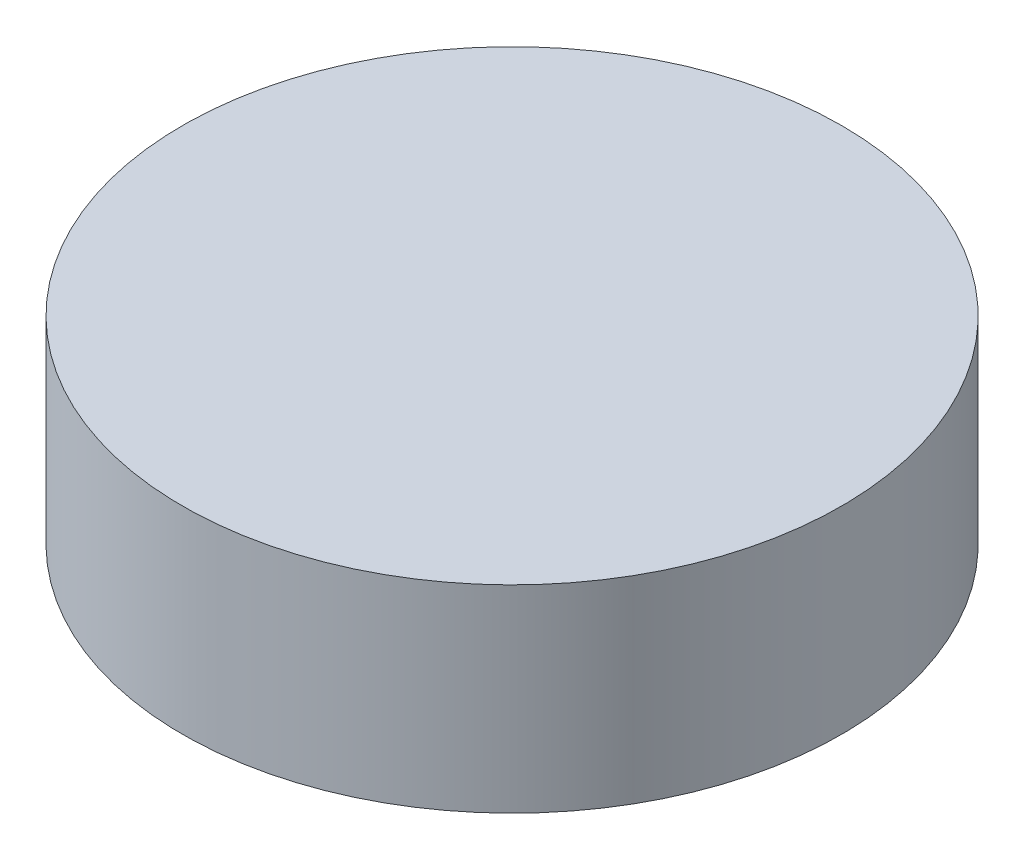
ISO-10303-21;
HEADER;
FILE_DESCRIPTION(('STEP AP214'),'2;1');
FILE_NAME('part.step','',(''),(''),'','','');
FILE_SCHEMA(('AUTOMOTIVE_DESIGN { 1 0 10303 214 1 1 1 1 }'));
ENDSEC;
DATA;
#1=APPLICATION_CONTEXT('core data for automotive mechanical design processes');
#2=APPLICATION_PROTOCOL_DEFINITION('international standard','automotive_design',2000,#1);
#3=PRODUCT_CONTEXT('',#1,'mechanical');
#4=PRODUCT('Part','Part','',(#3));
#5=PRODUCT_RELATED_PRODUCT_CATEGORY('part','',(#4));
#6=PRODUCT_DEFINITION_FORMATION('','',#4);
#7=PRODUCT_DEFINITION_CONTEXT('part definition',#1,'design');
#8=PRODUCT_DEFINITION('design','',#6,#7);
#9=PRODUCT_DEFINITION_SHAPE('','',#8);
#10=(LENGTH_UNIT() NAMED_UNIT(*) SI_UNIT(.MILLI.,.METRE.));
#11=(NAMED_UNIT(*) PLANE_ANGLE_UNIT() SI_UNIT($,.RADIAN.));
#12=(NAMED_UNIT(*) SI_UNIT($,.STERADIAN.) SOLID_ANGLE_UNIT());
#13=UNCERTAINTY_MEASURE_WITH_UNIT(LENGTH_MEASURE(1.E-05),#10,'distance_accuracy_value','');
#14=(GEOMETRIC_REPRESENTATION_CONTEXT(3) GLOBAL_UNCERTAINTY_ASSIGNED_CONTEXT((#13)) GLOBAL_UNIT_ASSIGNED_CONTEXT((#10,
#11,#12)) REPRESENTATION_CONTEXT('',''));
#15=CARTESIAN_POINT('',(0.,0.,0.));
#16=DIRECTION('',(0.,0.,1.));
#17=DIRECTION('',(1.,0.,0.));
#18=AXIS2_PLACEMENT_3D('',#15,#16,#17);
#19=CARTESIAN_POINT('',(0.,76.2,0.));
#20=DIRECTION('',(0.,-1.,0.));
#21=DIRECTION('',(0.,0.,-1.));
#22=AXIS2_PLACEMENT_3D('',#19,#20,#21);
#23=CYLINDRICAL_SURFACE('',#22,127.);
#24=CARTESIAN_POINT('',(0.,76.2,0.));
#25=DIRECTION('',(0.,1.,0.));
#26=DIRECTION('',(0.,0.,1.));
#27=AXIS2_PLACEMENT_3D('',#24,#25,#26);
#28=CIRCLE('',#27,127.);
#29=CARTESIAN_POINT('',(0.,76.2,-127.));
#30=VERTEX_POINT('',#29);
#31=EDGE_CURVE('E10',#30,#30,#28,.T.);
#32=CARTESIAN_POINT('',(0.,0.,0.));
#33=DIRECTION('',(0.,1.,0.));
#34=DIRECTION('',(0.,0.,1.));
#35=AXIS2_PLACEMENT_3D('',#32,#33,#34);
#36=CIRCLE('',#35,127.);
#37=CARTESIAN_POINT('',(0.,0.,-127.));
#38=VERTEX_POINT('',#37);
#39=EDGE_CURVE('E36',#38,#38,#36,.T.);
#40=CARTESIAN_POINT('',(0.,76.2,-127.));
#41=CARTESIAN_POINT('',(0.,75.40625,-127.));
#42=CARTESIAN_POINT('',(0.,74.6125,-127.));
#43=CARTESIAN_POINT('',(0.,73.025,-127.));
#44=CARTESIAN_POINT('',(0.,72.23125,-127.));
#45=CARTESIAN_POINT('',(0.,70.64375,-127.));
#46=CARTESIAN_POINT('',(0.,69.85,-127.));
#47=CARTESIAN_POINT('',(0.,68.2625,-127.));
#48=CARTESIAN_POINT('',(0.,67.46875,-127.));
#49=CARTESIAN_POINT('',(0.,65.88125,-127.));
#50=CARTESIAN_POINT('',(0.,65.0875,-127.));
#51=CARTESIAN_POINT('',(0.,63.5,-127.));
#52=CARTESIAN_POINT('',(0.,62.70625,-127.));
#53=CARTESIAN_POINT('',(0.,61.11875,-127.));
#54=CARTESIAN_POINT('',(0.,60.325,-127.));
#55=CARTESIAN_POINT('',(0.,58.7375,-127.));
#56=CARTESIAN_POINT('',(0.,57.94375,-127.));
#57=CARTESIAN_POINT('',(0.,56.35625,-127.));
#58=CARTESIAN_POINT('',(0.,55.5625,-127.));
#59=CARTESIAN_POINT('',(0.,53.975,-127.));
#60=CARTESIAN_POINT('',(0.,53.18125,-127.));
#61=CARTESIAN_POINT('',(0.,51.59375,-127.));
#62=CARTESIAN_POINT('',(0.,50.8,-127.));
#63=CARTESIAN_POINT('',(0.,49.2125,-127.));
#64=CARTESIAN_POINT('',(0.,48.41875,-127.));
#65=CARTESIAN_POINT('',(0.,46.83125,-127.));
#66=CARTESIAN_POINT('',(0.,46.0375,-127.));
#67=CARTESIAN_POINT('',(0.,44.45,-127.));
#68=CARTESIAN_POINT('',(0.,43.65625,-127.));
#69=CARTESIAN_POINT('',(0.,42.06875,-127.));
#70=CARTESIAN_POINT('',(0.,41.275,-127.));
#71=CARTESIAN_POINT('',(0.,39.6875,-127.));
#72=CARTESIAN_POINT('',(0.,38.89375,-127.));
#73=CARTESIAN_POINT('',(0.,37.30625,-127.));
#74=CARTESIAN_POINT('',(0.,36.5125,-127.));
#75=CARTESIAN_POINT('',(0.,34.925,-127.));
#76=CARTESIAN_POINT('',(0.,34.13125,-127.));
#77=CARTESIAN_POINT('',(0.,32.54375,-127.));
#78=CARTESIAN_POINT('',(0.,31.75,-127.));
#79=CARTESIAN_POINT('',(0.,30.1625,-127.));
#80=CARTESIAN_POINT('',(0.,29.36875,-127.));
#81=CARTESIAN_POINT('',(0.,27.78125,-127.));
#82=CARTESIAN_POINT('',(0.,26.9875,-127.));
#83=CARTESIAN_POINT('',(0.,25.4,-127.));
#84=CARTESIAN_POINT('',(0.,24.60625,-127.));
#85=CARTESIAN_POINT('',(0.,23.01875,-127.));
#86=CARTESIAN_POINT('',(0.,22.225,-127.));
#87=CARTESIAN_POINT('',(0.,20.6375,-127.));
#88=CARTESIAN_POINT('',(0.,19.84375,-127.));
#89=CARTESIAN_POINT('',(0.,18.25625,-127.));
#90=CARTESIAN_POINT('',(0.,17.4625,-127.));
#91=CARTESIAN_POINT('',(0.,15.875,-127.));
#92=CARTESIAN_POINT('',(0.,15.08125,-127.));
#93=CARTESIAN_POINT('',(0.,13.49375,-127.));
#94=CARTESIAN_POINT('',(0.,12.7,-127.));
#95=CARTESIAN_POINT('',(0.,11.1125,-127.));
#96=CARTESIAN_POINT('',(0.,10.31875,-127.));
#97=CARTESIAN_POINT('',(0.,8.73125,-127.));
#98=CARTESIAN_POINT('',(0.,7.93750000000001,-127.));
#99=CARTESIAN_POINT('',(0.,6.35,-127.));
#100=CARTESIAN_POINT('',(0.,5.55625,-127.));
#101=CARTESIAN_POINT('',(0.,3.96875,-127.));
#102=CARTESIAN_POINT('',(0.,3.175,-127.));
#103=CARTESIAN_POINT('',(0.,1.5875,-127.));
#104=CARTESIAN_POINT('',(0.,0.793750000000001,-127.));
#105=CARTESIAN_POINT('',(0.,0.,-127.));
#106=B_SPLINE_CURVE_WITH_KNOTS('',3,(#40,#41,#42,#43,#44,#45,#46,#47,#48,#49,#50,#51,#52,#53,
#54,#55,#56,#57,#58,#59,#60,#61,#62,#63,#64,#65,#66,#67,#68,#69,#70,#71,#72,#73,#74,#75,#76,#77,
#78,#79,#80,#81,#82,#83,#84,#85,#86,#87,#88,#89,#90,#91,#92,#93,#94,#95,#96,#97,#98,#99,#100,
#101,#102,#103,#104,#105),.UNSPECIFIED.,.F.,.F.,(4,2,2,2,2,2,2,2,2,2,2,2,2,2,2,2,2,2,2,2,2,2,2,
2,2,2,2,2,2,2,2,2,4),(0.,2.38124999999999,4.76249999999999,7.14374999999999,9.52499999999999,
11.90625,14.2875,16.66875,19.05,21.43125,23.8125,26.19375,28.575,30.95625,33.3375,35.71875,38.1,
40.48125,42.8625,45.24375,47.625,50.00625,52.3875,54.76875,57.15,59.53125,61.9125,64.29375,
66.675,69.05625,71.4375,73.81875,76.2),.UNSPECIFIED.);
#107=EDGE_CURVE('BSEAM33',#30,#38,#106,.T.);
#108=ORIENTED_EDGE('',*,*,#31,.F.);
#109=ORIENTED_EDGE('',*,*,#39,.T.);
#110=ORIENTED_EDGE('',*,*,#107,.T.);
#111=ORIENTED_EDGE('',*,*,#107,.F.);
#112=EDGE_LOOP('',(#108,#110,#109,#111));
#113=FACE_BOUND('',#112,.T.);
#114=ADVANCED_FACE('F33',(#113),#23,.T.);
#115=CARTESIAN_POINT('',(0.,76.2,0.));
#116=DIRECTION('',(0.,1.,0.));
#117=DIRECTION('',(0.,0.,1.));
#118=AXIS2_PLACEMENT_3D('',#115,#116,#117);
#119=PLANE('',#118);
#120=ORIENTED_EDGE('',*,*,#31,.T.);
#121=EDGE_LOOP('',(#120));
#122=FACE_BOUND('',#121,.T.);
#123=ADVANCED_FACE('F48',(#122),#119,.T.);
#124=CARTESIAN_POINT('',(0.,0.,0.));
#125=DIRECTION('',(0.,1.,0.));
#126=DIRECTION('',(0.,0.,1.));
#127=AXIS2_PLACEMENT_3D('',#124,#125,#126);
#128=PLANE('',#127);
#129=ORIENTED_EDGE('',*,*,#39,.F.);
#130=EDGE_LOOP('',(#129));
#131=FACE_BOUND('',#130,.T.);
#132=ADVANCED_FACE('F46',(#131),#128,.F.);
#133=CLOSED_SHELL('',(#114,#123,#132));
#134=MANIFOLD_SOLID_BREP('B2',#133);
#135=ADVANCED_BREP_SHAPE_REPRESENTATION('',(#18,#134),#14);
#136=SHAPE_DEFINITION_REPRESENTATION(#9,#135);
ENDSEC;
END-ISO-10303-21;
